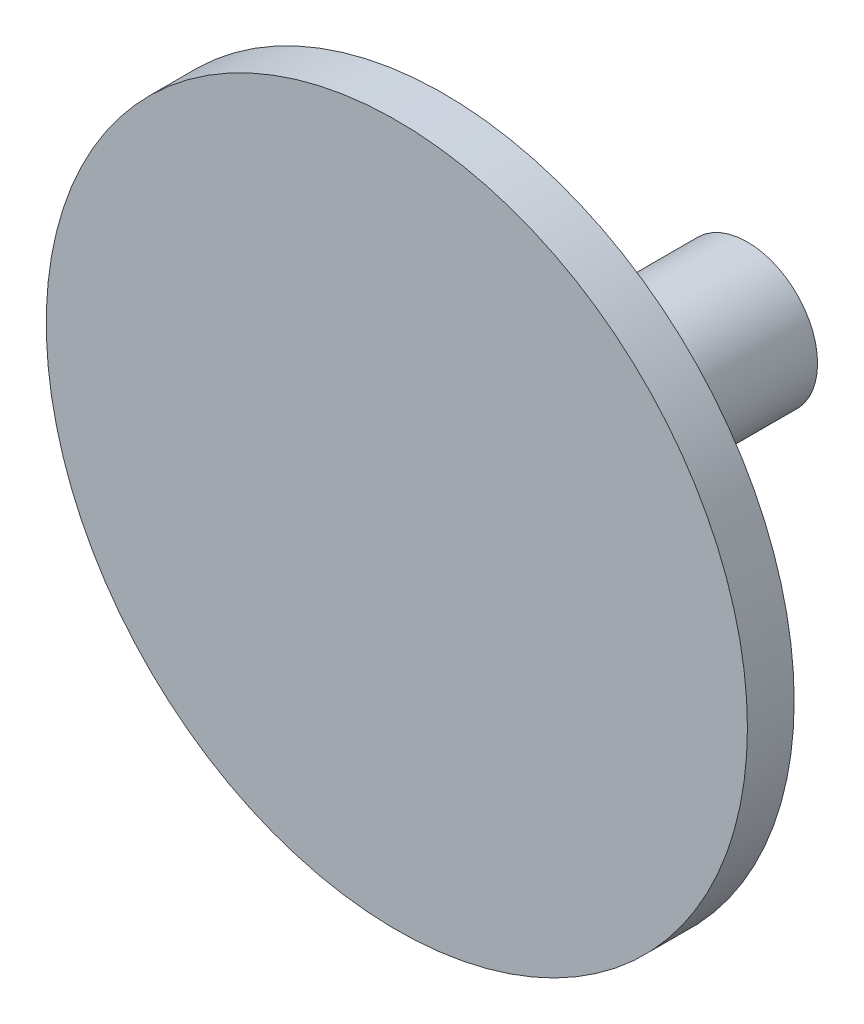
ISO-10303-21;
HEADER;
FILE_DESCRIPTION(('STEP AP214'),'2;1');
FILE_NAME('part.step','',(''),(''),'','','');
FILE_SCHEMA(('AUTOMOTIVE_DESIGN { 1 0 10303 214 1 1 1 1 }'));
ENDSEC;
DATA;
#1=APPLICATION_CONTEXT('core data for automotive mechanical design processes');
#2=APPLICATION_PROTOCOL_DEFINITION('international standard','automotive_design',2000,#1);
#3=PRODUCT_CONTEXT('',#1,'mechanical');
#4=PRODUCT('Part','Part','',(#3));
#5=PRODUCT_RELATED_PRODUCT_CATEGORY('part','',(#4));
#6=PRODUCT_DEFINITION_FORMATION('','',#4);
#7=PRODUCT_DEFINITION_CONTEXT('part definition',#1,'design');
#8=PRODUCT_DEFINITION('design','',#6,#7);
#9=PRODUCT_DEFINITION_SHAPE('','',#8);
#10=(LENGTH_UNIT() NAMED_UNIT(*) SI_UNIT(.MILLI.,.METRE.));
#11=(NAMED_UNIT(*) PLANE_ANGLE_UNIT() SI_UNIT($,.RADIAN.));
#12=(NAMED_UNIT(*) SI_UNIT($,.STERADIAN.) SOLID_ANGLE_UNIT());
#13=UNCERTAINTY_MEASURE_WITH_UNIT(LENGTH_MEASURE(1.E-05),#10,'distance_accuracy_value','');
#14=(GEOMETRIC_REPRESENTATION_CONTEXT(3) GLOBAL_UNCERTAINTY_ASSIGNED_CONTEXT((#13)) GLOBAL_UNIT_ASSIGNED_CONTEXT((#10,
#11,#12)) REPRESENTATION_CONTEXT('',''));
#15=CARTESIAN_POINT('',(0.,0.,0.));
#16=DIRECTION('',(0.,0.,1.));
#17=DIRECTION('',(1.,0.,0.));
#18=AXIS2_PLACEMENT_3D('',#15,#16,#17);
#19=CARTESIAN_POINT('',(0.,0.,-2.));
#20=DIRECTION('',(0.,0.,1.));
#21=DIRECTION('',(-1.,0.,0.));
#22=AXIS2_PLACEMENT_3D('',#19,#20,#21);
#23=CYLINDRICAL_SURFACE('',#22,15.);
#24=CARTESIAN_POINT('',(0.,0.,-2.));
#25=DIRECTION('',(0.,0.,1.));
#26=DIRECTION('',(1.,0.,0.));
#27=AXIS2_PLACEMENT_3D('',#24,#25,#26);
#28=CIRCLE('',#27,15.);
#29=CARTESIAN_POINT('',(15.,0.,-2.));
#30=VERTEX_POINT('',#29);
#31=EDGE_CURVE('E47',#30,#30,#28,.T.);
#32=ORIENTED_EDGE('',*,*,#31,.T.);
#33=EDGE_LOOP('',(#32));
#34=FACE_BOUND('',#33,.T.);
#35=CARTESIAN_POINT('',(0.,0.,0.));
#36=DIRECTION('',(0.,0.,1.));
#37=DIRECTION('',(1.,0.,0.));
#38=AXIS2_PLACEMENT_3D('',#35,#36,#37);
#39=CIRCLE('',#38,15.);
#40=CARTESIAN_POINT('',(15.,0.,0.));
#41=VERTEX_POINT('',#40);
#42=EDGE_CURVE('E38',#41,#41,#39,.T.);
#43=ORIENTED_EDGE('',*,*,#42,.F.);
#44=EDGE_LOOP('',(#43));
#45=FACE_BOUND('',#44,.T.);
#46=ADVANCED_FACE('F35',(#34,#45),#23,.T.);
#47=CARTESIAN_POINT('',(0.,0.,-2.));
#48=DIRECTION('',(0.,0.,-1.));
#49=DIRECTION('',(1.,0.,0.));
#50=AXIS2_PLACEMENT_3D('',#47,#48,#49);
#51=PLANE('',#50);
#52=CARTESIAN_POINT('',(0.,0.,-2.));
#53=DIRECTION('',(0.,0.,1.));
#54=DIRECTION('',(1.,0.,0.));
#55=AXIS2_PLACEMENT_3D('',#52,#53,#54);
#56=CIRCLE('',#55,6.875);
#57=CARTESIAN_POINT('',(6.875,0.,-2.));
#58=VERTEX_POINT('',#57);
#59=EDGE_CURVE('E42',#58,#58,#56,.T.);
#60=ORIENTED_EDGE('',*,*,#59,.T.);
#61=EDGE_LOOP('',(#60));
#62=FACE_BOUND('',#61,.T.);
#63=ORIENTED_EDGE('',*,*,#31,.F.);
#64=EDGE_LOOP('',(#63));
#65=FACE_BOUND('',#64,.T.);
#66=ADVANCED_FACE('F63',(#62,#65),#51,.T.);
#67=CARTESIAN_POINT('',(0.,0.,0.));
#68=DIRECTION('',(0.,0.,-1.));
#69=DIRECTION('',(1.,0.,0.));
#70=AXIS2_PLACEMENT_3D('',#67,#68,#69);
#71=PLANE('',#70);
#72=ORIENTED_EDGE('',*,*,#42,.T.);
#73=EDGE_LOOP('',(#72));
#74=FACE_BOUND('',#73,.T.);
#75=ADVANCED_FACE('F60',(#74),#71,.F.);
#76=CARTESIAN_POINT('',(0.,0.,-7.));
#77=DIRECTION('',(0.,0.,1.));
#78=DIRECTION('',(-1.,0.,0.));
#79=AXIS2_PLACEMENT_3D('',#76,#77,#78);
#80=CYLINDRICAL_SURFACE('',#79,6.875);
#81=CARTESIAN_POINT('',(0.,0.,-7.));
#82=DIRECTION('',(0.,0.,1.));
#83=DIRECTION('',(1.,0.,0.));
#84=AXIS2_PLACEMENT_3D('',#81,#82,#83);
#85=CIRCLE('',#84,6.875);
#86=CARTESIAN_POINT('',(6.875,0.,-7.));
#87=VERTEX_POINT('',#86);
#88=EDGE_CURVE('E52',#87,#87,#85,.T.);
#89=ORIENTED_EDGE('',*,*,#88,.T.);
#90=EDGE_LOOP('',(#89));
#91=FACE_BOUND('',#90,.T.);
#92=ORIENTED_EDGE('',*,*,#59,.F.);
#93=EDGE_LOOP('',(#92));
#94=FACE_BOUND('',#93,.T.);
#95=ADVANCED_FACE('F72',(#91,#94),#80,.T.);
#96=CARTESIAN_POINT('',(0.,0.,-7.));
#97=DIRECTION('',(0.,0.,-1.));
#98=DIRECTION('',(1.,0.,0.));
#99=AXIS2_PLACEMENT_3D('',#96,#97,#98);
#100=PLANE('',#99);
#101=CARTESIAN_POINT('',(0.,0.,-7.));
#102=DIRECTION('',(0.,0.,1.));
#103=DIRECTION('',(1.,0.,0.));
#104=AXIS2_PLACEMENT_3D('',#101,#102,#103);
#105=CIRCLE('',#104,3.);
#106=CARTESIAN_POINT('',(3.,0.,-7.));
#107=VERTEX_POINT('',#106);
#108=EDGE_CURVE('E10',#107,#107,#105,.T.);
#109=ORIENTED_EDGE('',*,*,#108,.T.);
#110=EDGE_LOOP('',(#109));
#111=FACE_BOUND('',#110,.T.);
#112=ORIENTED_EDGE('',*,*,#88,.F.);
#113=EDGE_LOOP('',(#112));
#114=FACE_BOUND('',#113,.T.);
#115=ADVANCED_FACE('F77',(#111,#114),#100,.T.);
#116=CARTESIAN_POINT('',(0.,0.,-15.));
#117=DIRECTION('',(0.,0.,1.));
#118=DIRECTION('',(-1.,0.,0.));
#119=AXIS2_PLACEMENT_3D('',#116,#117,#118);
#120=CYLINDRICAL_SURFACE('',#119,3.);
#121=CARTESIAN_POINT('',(0.,0.,-15.));
#122=DIRECTION('',(0.,0.,1.));
#123=DIRECTION('',(1.,0.,0.));
#124=AXIS2_PLACEMENT_3D('',#121,#122,#123);
#125=CIRCLE('',#124,3.);
#126=CARTESIAN_POINT('',(3.,0.,-15.));
#127=VERTEX_POINT('',#126);
#128=EDGE_CURVE('E51',#127,#127,#125,.T.);
#129=ORIENTED_EDGE('',*,*,#128,.T.);
#130=EDGE_LOOP('',(#129));
#131=FACE_BOUND('',#130,.T.);
#132=ORIENTED_EDGE('',*,*,#108,.F.);
#133=EDGE_LOOP('',(#132));
#134=FACE_BOUND('',#133,.T.);
#135=ADVANCED_FACE('F81',(#131,#134),#120,.T.);
#136=CARTESIAN_POINT('',(0.,0.,-15.));
#137=DIRECTION('',(0.,0.,-1.));
#138=DIRECTION('',(1.,0.,0.));
#139=AXIS2_PLACEMENT_3D('',#136,#137,#138);
#140=PLANE('',#139);
#141=ORIENTED_EDGE('',*,*,#128,.F.);
#142=EDGE_LOOP('',(#141));
#143=FACE_BOUND('',#142,.T.);
#144=ADVANCED_FACE('F84',(#143),#140,.T.);
#145=CLOSED_SHELL('',(#46,#66,#75,#95,#115,#135,#144));
#146=MANIFOLD_SOLID_BREP('B2',#145);
#147=ADVANCED_BREP_SHAPE_REPRESENTATION('',(#18,#146),#14);
#148=SHAPE_DEFINITION_REPRESENTATION(#9,#147);
ENDSEC;
END-ISO-10303-21;
